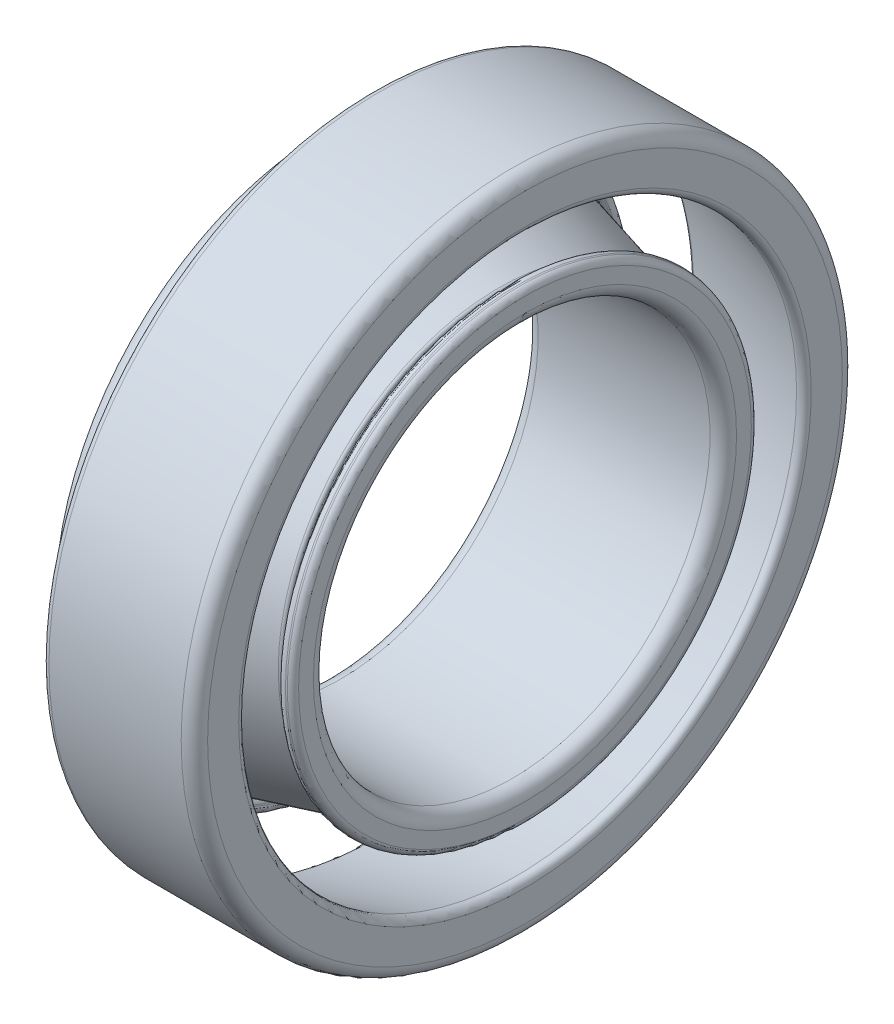
ISO-10303-21;
HEADER;
FILE_DESCRIPTION(('STEP AP214'),'2;1');
FILE_NAME('part.step','',(''),(''),'','','');
FILE_SCHEMA(('AUTOMOTIVE_DESIGN { 1 0 10303 214 1 1 1 1 }'));
ENDSEC;
DATA;
#1=APPLICATION_CONTEXT('core data for automotive mechanical design processes');
#2=APPLICATION_PROTOCOL_DEFINITION('international standard','automotive_design',2000,#1);
#3=PRODUCT_CONTEXT('',#1,'mechanical');
#4=PRODUCT('Part','Part','',(#3));
#5=PRODUCT_RELATED_PRODUCT_CATEGORY('part','',(#4));
#6=PRODUCT_DEFINITION_FORMATION('','',#4);
#7=PRODUCT_DEFINITION_CONTEXT('part definition',#1,'design');
#8=PRODUCT_DEFINITION('design','',#6,#7);
#9=PRODUCT_DEFINITION_SHAPE('','',#8);
#10=(LENGTH_UNIT() NAMED_UNIT(*) SI_UNIT(.MILLI.,.METRE.));
#11=(NAMED_UNIT(*) PLANE_ANGLE_UNIT() SI_UNIT($,.RADIAN.));
#12=(NAMED_UNIT(*) SI_UNIT($,.STERADIAN.) SOLID_ANGLE_UNIT());
#13=UNCERTAINTY_MEASURE_WITH_UNIT(LENGTH_MEASURE(1.E-05),#10,'distance_accuracy_value','');
#14=(GEOMETRIC_REPRESENTATION_CONTEXT(3) GLOBAL_UNCERTAINTY_ASSIGNED_CONTEXT((#13)) GLOBAL_UNIT_ASSIGNED_CONTEXT((#10,
#11,#12)) REPRESENTATION_CONTEXT('',''));
#15=CARTESIAN_POINT('',(0.,0.,0.));
#16=DIRECTION('',(0.,0.,1.));
#17=DIRECTION('',(1.,0.,0.));
#18=AXIS2_PLACEMENT_3D('',#15,#16,#17);
#19=CARTESIAN_POINT('',(-2.00000000000001,0.,0.));
#20=DIRECTION('',(-1.,0.,0.));
#21=DIRECTION('',(0.,0.,1.));
#22=AXIS2_PLACEMENT_3D('',#19,#20,#21);
#23=TOROIDAL_SURFACE('',#22,32.,2.);
#24=CARTESIAN_POINT('',(0.,0.,0.));
#25=DIRECTION('',(-1.,0.,0.));
#26=DIRECTION('',(0.,0.,1.));
#27=AXIS2_PLACEMENT_3D('',#24,#25,#26);
#28=CIRCLE('',#27,32.);
#29=CARTESIAN_POINT('',(0.,0.,32.));
#30=VERTEX_POINT('',#29);
#31=EDGE_CURVE('E105',#30,#30,#28,.T.);
#32=ORIENTED_EDGE('',*,*,#31,.F.);
#33=EDGE_LOOP('',(#32));
#34=FACE_BOUND('',#33,.T.);
#35=CARTESIAN_POINT('',(-2.00000000000002,0.,0.));
#36=DIRECTION('',(-1.,0.,0.));
#37=DIRECTION('',(0.,0.,1.));
#38=AXIS2_PLACEMENT_3D('',#35,#36,#37);
#39=CIRCLE('',#38,30.);
#40=CARTESIAN_POINT('',(-2.00000000000002,0.,30.));
#41=VERTEX_POINT('',#40);
#42=EDGE_CURVE('E11',#41,#41,#39,.T.);
#43=ORIENTED_EDGE('',*,*,#42,.T.);
#44=EDGE_LOOP('',(#43));
#45=FACE_BOUND('',#44,.T.);
#46=ADVANCED_FACE('F41',(#34,#45),#23,.T.);
#47=CARTESIAN_POINT('',(0.,0.,0.));
#48=DIRECTION('',(-1.,0.,0.));
#49=DIRECTION('',(0.,0.,1.));
#50=AXIS2_PLACEMENT_3D('',#47,#48,#49);
#51=CYLINDRICAL_SURFACE('',#50,30.);
#52=ORIENTED_EDGE('',*,*,#42,.F.);
#53=EDGE_LOOP('',(#52));
#54=FACE_BOUND('',#53,.T.);
#55=CARTESIAN_POINT('',(-28.,0.,0.));
#56=DIRECTION('',(-1.,0.,0.));
#57=DIRECTION('',(0.,0.,1.));
#58=AXIS2_PLACEMENT_3D('',#55,#56,#57);
#59=CIRCLE('',#58,30.);
#60=CARTESIAN_POINT('',(-28.,0.,30.));
#61=VERTEX_POINT('',#60);
#62=EDGE_CURVE('E47',#61,#61,#59,.T.);
#63=ORIENTED_EDGE('',*,*,#62,.T.);
#64=EDGE_LOOP('',(#63));
#65=FACE_BOUND('',#64,.T.);
#66=ADVANCED_FACE('F112',(#54,#65),#51,.F.);
#67=CARTESIAN_POINT('',(-28.,0.,0.));
#68=DIRECTION('',(-1.,0.,0.));
#69=DIRECTION('',(0.,0.,1.));
#70=AXIS2_PLACEMENT_3D('',#67,#68,#69);
#71=TOROIDAL_SURFACE('',#70,32.,2.);
#72=ORIENTED_EDGE('',*,*,#62,.F.);
#73=EDGE_LOOP('',(#72));
#74=FACE_BOUND('',#73,.T.);
#75=CARTESIAN_POINT('',(-30.,0.,0.));
#76=DIRECTION('',(-1.,0.,0.));
#77=DIRECTION('',(0.,0.,1.));
#78=AXIS2_PLACEMENT_3D('',#75,#76,#77);
#79=CIRCLE('',#78,32.);
#80=CARTESIAN_POINT('',(-30.,0.,32.));
#81=VERTEX_POINT('',#80);
#82=EDGE_CURVE('E51',#81,#81,#79,.T.);
#83=ORIENTED_EDGE('',*,*,#82,.T.);
#84=EDGE_LOOP('',(#83));
#85=FACE_BOUND('',#84,.T.);
#86=ADVANCED_FACE('F116',(#74,#85),#71,.T.);
#87=CARTESIAN_POINT('',(-30.,32.,0.));
#88=DIRECTION('',(1.,0.,0.));
#89=DIRECTION('',(0.,0.,-1.));
#90=AXIS2_PLACEMENT_3D('',#87,#88,#89);
#91=PLANE('',#90);
#92=ORIENTED_EDGE('',*,*,#82,.F.);
#93=EDGE_LOOP('',(#92));
#94=FACE_BOUND('',#93,.T.);
#95=CARTESIAN_POINT('',(-30.,0.,0.));
#96=DIRECTION('',(-1.,0.,0.));
#97=DIRECTION('',(0.,0.,1.));
#98=AXIS2_PLACEMENT_3D('',#95,#96,#97);
#99=CIRCLE('',#98,40.2432981977286);
#100=CARTESIAN_POINT('',(-30.,0.,40.2432981977286));
#101=VERTEX_POINT('',#100);
#102=EDGE_CURVE('E55',#101,#101,#99,.T.);
#103=ORIENTED_EDGE('',*,*,#102,.T.);
#104=EDGE_LOOP('',(#103));
#105=FACE_BOUND('',#104,.T.);
#106=ADVANCED_FACE('F121',(#94,#105),#91,.F.);
#107=CARTESIAN_POINT('',(-28.,0.,0.));
#108=DIRECTION('',(-1.,0.,0.));
#109=DIRECTION('',(0.,0.,1.));
#110=AXIS2_PLACEMENT_3D('',#107,#108,#109);
#111=TOROIDAL_SURFACE('',#110,40.2432981977286,1.99999999999998);
#112=ORIENTED_EDGE('',*,*,#102,.F.);
#113=EDGE_LOOP('',(#112));
#114=FACE_BOUND('',#113,.T.);
#115=CARTESIAN_POINT('',(-27.4955232455346,0.,0.));
#116=DIRECTION('',(-1.,0.,0.));
#117=DIRECTION('',(0.,0.,1.));
#118=AXIS2_PLACEMENT_3D('',#115,#116,#117);
#119=CIRCLE('',#118,42.1786284548692);
#120=CARTESIAN_POINT('',(-27.4955232455346,0.,42.1786284548692));
#121=VERTEX_POINT('',#120);
#122=EDGE_CURVE('E60',#121,#121,#119,.T.);
#123=ORIENTED_EDGE('',*,*,#122,.T.);
#124=EDGE_LOOP('',(#123));
#125=FACE_BOUND('',#124,.T.);
#126=ADVANCED_FACE('F127',(#114,#125),#111,.T.);
#127=CARTESIAN_POINT('',(-25.9506470557311,0.,0.));
#128=DIRECTION('',(-1.,0.,0.));
#129=DIRECTION('',(0.,0.,1.));
#130=AXIS2_PLACEMENT_3D('',#127,#128,#129);
#131=CONICAL_SURFACE('',#130,41.7759301952789,0.254992733634665);
#132=ORIENTED_EDGE('',*,*,#122,.F.);
#133=EDGE_LOOP('',(#132));
#134=FACE_BOUND('',#133,.T.);
#135=CARTESIAN_POINT('',(-25.9506470557311,0.,0.));
#136=DIRECTION('',(-1.,0.,0.));
#137=DIRECTION('',(0.,0.,1.));
#138=AXIS2_PLACEMENT_3D('',#135,#136,#137);
#139=CIRCLE('',#138,41.7759301952789);
#140=CARTESIAN_POINT('',(-25.9506470557311,0.,41.7759301952789));
#141=VERTEX_POINT('',#140);
#142=EDGE_CURVE('E63',#141,#141,#139,.T.);
#143=ORIENTED_EDGE('',*,*,#142,.T.);
#144=EDGE_LOOP('',(#143));
#145=FACE_BOUND('',#144,.T.);
#146=ADVANCED_FACE('F131',(#134,#145),#131,.T.);
#147=CARTESIAN_POINT('',(-26.2028854329638,0.,0.));
#148=DIRECTION('',(-1.,0.,0.));
#149=DIRECTION('',(0.,0.,1.));
#150=AXIS2_PLACEMENT_3D('',#147,#148,#149);
#151=TOROIDAL_SURFACE('',#150,40.8082650667086,0.999999999999995);
#152=ORIENTED_EDGE('',*,*,#142,.F.);
#153=EDGE_LOOP('',(#152));
#154=FACE_BOUND('',#153,.T.);
#155=CARTESIAN_POINT('',(-25.2352203043935,0.,0.));
#156=DIRECTION('',(-1.,0.,0.));
#157=DIRECTION('',(0.,0.,1.));
#158=AXIS2_PLACEMENT_3D('',#155,#156,#157);
#159=CIRCLE('',#158,40.5560266894759);
#160=CARTESIAN_POINT('',(-25.2352203043935,0.,40.5560266894759));
#161=VERTEX_POINT('',#160);
#162=EDGE_CURVE('E66',#161,#161,#159,.T.);
#163=ORIENTED_EDGE('',*,*,#162,.T.);
#164=EDGE_LOOP('',(#163));
#165=FACE_BOUND('',#164,.T.);
#166=ADVANCED_FACE('F135',(#154,#165),#151,.T.);
#167=CARTESIAN_POINT('',(-25.2820827739324,0.,0.));
#168=DIRECTION('',(1.,0.,0.));
#169=DIRECTION('',(0.,0.,-1.));
#170=AXIS2_PLACEMENT_3D('',#167,#168,#169);
#171=CONICAL_SURFACE('',#170,40.3762476324231,1.31580359316017);
#172=ORIENTED_EDGE('',*,*,#162,.F.);
#173=EDGE_LOOP('',(#172));
#174=FACE_BOUND('',#173,.T.);
#175=CARTESIAN_POINT('',(-25.2820827739324,0.,0.));
#176=DIRECTION('',(-1.,0.,0.));
#177=DIRECTION('',(0.,0.,1.));
#178=AXIS2_PLACEMENT_3D('',#175,#176,#177);
#179=CIRCLE('',#178,40.3762476324231);
#180=CARTESIAN_POINT('',(-25.2820827739324,0.,40.3762476324231));
#181=VERTEX_POINT('',#180);
#182=EDGE_CURVE('E69',#181,#181,#179,.T.);
#183=ORIENTED_EDGE('',*,*,#182,.T.);
#184=EDGE_LOOP('',(#183));
#185=FACE_BOUND('',#184,.T.);
#186=ADVANCED_FACE('F139',(#174,#185),#171,.F.);
#187=CARTESIAN_POINT('',(-25.7659153382175,0.,0.));
#188=DIRECTION('',(-1.,0.,0.));
#189=DIRECTION('',(0.,0.,1.));
#190=AXIS2_PLACEMENT_3D('',#187,#188,#189);
#191=TOROIDAL_SURFACE('',#190,40.5023668210394,0.500000000000021);
#192=ORIENTED_EDGE('',*,*,#182,.F.);
#193=EDGE_LOOP('',(#192));
#194=FACE_BOUND('',#193,.T.);
#195=CARTESIAN_POINT('',(-25.7235441281336,0.,0.));
#196=DIRECTION('',(-1.,0.,0.));
#197=DIRECTION('',(0.,0.,1.));
#198=AXIS2_PLACEMENT_3D('',#195,#196,#197);
#199=CIRCLE('',#198,40.0041653752807);
#200=CARTESIAN_POINT('',(-25.7235441281336,0.,40.0041653752807));
#201=VERTEX_POINT('',#200);
#202=EDGE_CURVE('E72',#201,#201,#199,.T.);
#203=ORIENTED_EDGE('',*,*,#202,.T.);
#204=EDGE_LOOP('',(#203));
#205=FACE_BOUND('',#204,.T.);
#206=ADVANCED_FACE('F143',(#194,#205),#191,.T.);
#207=CARTESIAN_POINT('',(-25.6388017079659,0.,0.));
#208=DIRECTION('',(-1.,0.,0.));
#209=DIRECTION('',(0.,0.,1.));
#210=AXIS2_PLACEMENT_3D('',#207,#208,#209);
#211=TOROIDAL_SURFACE('',#210,39.0077624837634,1.);
#212=ORIENTED_EDGE('',*,*,#202,.F.);
#213=EDGE_LOOP('',(#212));
#214=FACE_BOUND('',#213,.T.);
#215=CARTESIAN_POINT('',(-24.8105577346037,0.,0.));
#216=DIRECTION('',(-1.,0.,0.));
#217=DIRECTION('',(0.,0.,1.));
#218=AXIS2_PLACEMENT_3D('',#215,#216,#217);
#219=CIRCLE('',#218,38.4473948182176);
#220=CARTESIAN_POINT('',(-24.8105577346037,0.,38.4473948182176));
#221=VERTEX_POINT('',#220);
#222=EDGE_CURVE('E75',#221,#221,#219,.T.);
#223=ORIENTED_EDGE('',*,*,#222,.T.);
#224=EDGE_LOOP('',(#223));
#225=FACE_BOUND('',#224,.T.);
#226=ADVANCED_FACE('F147',(#214,#225),#211,.F.);
#227=CARTESIAN_POINT('',(-24.3964357479226,0.,0.));
#228=DIRECTION('',(-1.,0.,0.));
#229=DIRECTION('',(0.,0.,1.));
#230=AXIS2_PLACEMENT_3D('',#227,#228,#229);
#231=TOROIDAL_SURFACE('',#230,38.1672109854448,0.499999999999998);
#232=ORIENTED_EDGE('',*,*,#222,.F.);
#233=EDGE_LOOP('',(#232));
#234=FACE_BOUND('',#233,.T.);
#235=CARTESIAN_POINT('',(-24.2703165593062,0.,0.));
#236=DIRECTION('',(-1.,0.,0.));
#237=DIRECTION('',(0.,0.,1.));
#238=AXIS2_PLACEMENT_3D('',#235,#236,#237);
#239=CIRCLE('',#238,38.6510435497299);
#240=CARTESIAN_POINT('',(-24.2703165593062,0.,38.6510435497299));
#241=VERTEX_POINT('',#240);
#242=EDGE_CURVE('E78',#241,#241,#239,.T.);
#243=ORIENTED_EDGE('',*,*,#242,.T.);
#244=EDGE_LOOP('',(#243));
#245=FACE_BOUND('',#244,.T.);
#246=ADVANCED_FACE('F151',(#234,#245),#231,.T.);
#247=CARTESIAN_POINT('',(-3.95963518660535,0.,0.));
#248=DIRECTION('',(-1.,0.,0.));
#249=DIRECTION('',(0.,0.,1.));
#250=AXIS2_PLACEMENT_3D('',#247,#248,#249);
#251=CONICAL_SURFACE('',#250,33.3567189340335,0.254992733634694);
#252=ORIENTED_EDGE('',*,*,#242,.F.);
#253=EDGE_LOOP('',(#252));
#254=FACE_BOUND('',#253,.T.);
#255=CARTESIAN_POINT('',(-3.95963518660535,0.,0.));
#256=DIRECTION('',(-1.,0.,0.));
#257=DIRECTION('',(0.,0.,1.));
#258=AXIS2_PLACEMENT_3D('',#255,#256,#257);
#259=CIRCLE('',#258,33.3567189340335);
#260=CARTESIAN_POINT('',(-3.95963518660535,0.,33.3567189340335));
#261=VERTEX_POINT('',#260);
#262=EDGE_CURVE('E81',#261,#261,#259,.T.);
#263=ORIENTED_EDGE('',*,*,#262,.T.);
#264=EDGE_LOOP('',(#263));
#265=FACE_BOUND('',#264,.T.);
#266=ADVANCED_FACE('F155',(#254,#265),#251,.T.);
#267=CARTESIAN_POINT('',(-4.08575437522171,0.,0.));
#268=DIRECTION('',(-1.,0.,0.));
#269=DIRECTION('',(0.,0.,1.));
#270=AXIS2_PLACEMENT_3D('',#267,#268,#269);
#271=TOROIDAL_SURFACE('',#270,32.8728863697483,0.5);
#272=ORIENTED_EDGE('',*,*,#262,.F.);
#273=EDGE_LOOP('',(#272));
#274=FACE_BOUND('',#273,.T.);
#275=CARTESIAN_POINT('',(-3.58755292946304,0.,0.));
#276=DIRECTION('',(-1.,0.,0.));
#277=DIRECTION('',(0.,0.,1.));
#278=AXIS2_PLACEMENT_3D('',#275,#276,#277);
#279=CIRCLE('',#278,32.9152575798322);
#280=CARTESIAN_POINT('',(-3.58755292946304,0.,32.9152575798322));
#281=VERTEX_POINT('',#280);
#282=EDGE_CURVE('E84',#281,#281,#279,.T.);
#283=ORIENTED_EDGE('',*,*,#282,.T.);
#284=EDGE_LOOP('',(#283));
#285=FACE_BOUND('',#284,.T.);
#286=ADVANCED_FACE('F159',(#274,#285),#271,.T.);
#287=CARTESIAN_POINT('',(-2.5911500379457,0.,0.));
#288=DIRECTION('',(-1.,0.,0.));
#289=DIRECTION('',(0.,0.,1.));
#290=AXIS2_PLACEMENT_3D('',#287,#288,#289);
#291=TOROIDAL_SURFACE('',#290,33.,1.);
#292=ORIENTED_EDGE('',*,*,#282,.F.);
#293=EDGE_LOOP('',(#292));
#294=FACE_BOUND('',#293,.T.);
#295=CARTESIAN_POINT('',(-2.03078237239993,0.,0.));
#296=DIRECTION('',(-1.,0.,0.));
#297=DIRECTION('',(0.,0.,1.));
#298=AXIS2_PLACEMENT_3D('',#295,#296,#297);
#299=CIRCLE('',#298,33.8282439733622);
#300=CARTESIAN_POINT('',(-2.03078237239993,0.,33.8282439733622));
#301=VERTEX_POINT('',#300);
#302=EDGE_CURVE('E87',#301,#301,#299,.T.);
#303=ORIENTED_EDGE('',*,*,#302,.T.);
#304=EDGE_LOOP('',(#303));
#305=FACE_BOUND('',#304,.T.);
#306=ADVANCED_FACE('F163',(#294,#305),#291,.F.);
#307=CARTESIAN_POINT('',(-1.75059853962705,0.,0.));
#308=DIRECTION('',(-1.,0.,0.));
#309=DIRECTION('',(0.,0.,1.));
#310=AXIS2_PLACEMENT_3D('',#307,#308,#309);
#311=TOROIDAL_SURFACE('',#310,34.2423659600433,0.500000000000001);
#312=ORIENTED_EDGE('',*,*,#302,.F.);
#313=EDGE_LOOP('',(#312));
#314=FACE_BOUND('',#313,.T.);
#315=CARTESIAN_POINT('',(-2.23443110391221,0.,0.));
#316=DIRECTION('',(-1.,0.,0.));
#317=DIRECTION('',(0.,0.,1.));
#318=AXIS2_PLACEMENT_3D('',#315,#316,#317);
#319=CIRCLE('',#318,34.3684851486596);
#320=CARTESIAN_POINT('',(-2.23443110391221,0.,34.3684851486596));
#321=VERTEX_POINT('',#320);
#322=EDGE_CURVE('E90',#321,#321,#319,.T.);
#323=ORIENTED_EDGE('',*,*,#322,.T.);
#324=EDGE_LOOP('',(#323));
#325=FACE_BOUND('',#324,.T.);
#326=ADVANCED_FACE('F167',(#314,#325),#311,.T.);
#327=CARTESIAN_POINT('',(-2.18756863437334,0.,0.));
#328=DIRECTION('',(1.,0.,0.));
#329=DIRECTION('',(0.,0.,-1.));
#330=AXIS2_PLACEMENT_3D('',#327,#328,#329);
#331=CONICAL_SURFACE('',#330,34.5482642057125,1.3158035931601);
#332=ORIENTED_EDGE('',*,*,#322,.F.);
#333=EDGE_LOOP('',(#332));
#334=FACE_BOUND('',#333,.T.);
#335=CARTESIAN_POINT('',(-2.18756863437334,0.,0.));
#336=DIRECTION('',(-1.,0.,0.));
#337=DIRECTION('',(0.,0.,1.));
#338=AXIS2_PLACEMENT_3D('',#335,#336,#337);
#339=CIRCLE('',#338,34.5482642057125);
#340=CARTESIAN_POINT('',(-2.18756863437334,0.,34.5482642057125));
#341=VERTEX_POINT('',#340);
#342=EDGE_CURVE('E93',#341,#341,#339,.T.);
#343=ORIENTED_EDGE('',*,*,#342,.T.);
#344=EDGE_LOOP('',(#343));
#345=FACE_BOUND('',#344,.T.);
#346=ADVANCED_FACE('F171',(#334,#345),#331,.T.);
#347=CARTESIAN_POINT('',(-1.21990350580303,0.,0.));
#348=DIRECTION('',(-1.,0.,0.));
#349=DIRECTION('',(0.,0.,1.));
#350=AXIS2_PLACEMENT_3D('',#347,#348,#349);
#351=TOROIDAL_SURFACE('',#350,34.2960258284798,0.99999999999998);
#352=ORIENTED_EDGE('',*,*,#342,.F.);
#353=EDGE_LOOP('',(#352));
#354=FACE_BOUND('',#353,.T.);
#355=CARTESIAN_POINT('',(-0.967665128570324,0.,0.));
#356=DIRECTION('',(-1.,0.,0.));
#357=DIRECTION('',(0.,0.,1.));
#358=AXIS2_PLACEMENT_3D('',#355,#356,#357);
#359=CIRCLE('',#358,35.2636909570501);
#360=CARTESIAN_POINT('',(-0.967665128570324,0.,35.2636909570501));
#361=VERTEX_POINT('',#360);
#362=EDGE_CURVE('E96',#361,#361,#359,.T.);
#363=ORIENTED_EDGE('',*,*,#362,.T.);
#364=EDGE_LOOP('',(#363));
#365=FACE_BOUND('',#364,.T.);
#366=ADVANCED_FACE('F175',(#354,#365),#351,.T.);
#367=CARTESIAN_POINT('',(-0.747761622767286,0.,0.));
#368=DIRECTION('',(-1.,0.,0.));
#369=DIRECTION('',(0.,0.,1.));
#370=AXIS2_PLACEMENT_3D('',#367,#368,#369);
#371=CONICAL_SURFACE('',#370,35.206369367366,0.254992733634642);
#372=ORIENTED_EDGE('',*,*,#362,.F.);
#373=EDGE_LOOP('',(#372));
#374=FACE_BOUND('',#373,.T.);
#375=CARTESIAN_POINT('',(-0.747761622767286,0.,0.));
#376=DIRECTION('',(-1.,0.,0.));
#377=DIRECTION('',(0.,0.,1.));
#378=AXIS2_PLACEMENT_3D('',#375,#376,#377);
#379=CIRCLE('',#378,35.206369367366);
#380=CARTESIAN_POINT('',(-0.747761622767286,0.,35.206369367366));
#381=VERTEX_POINT('',#380);
#382=EDGE_CURVE('E99',#381,#381,#379,.T.);
#383=ORIENTED_EDGE('',*,*,#382,.T.);
#384=EDGE_LOOP('',(#383));
#385=FACE_BOUND('',#384,.T.);
#386=ADVANCED_FACE('F179',(#374,#385),#371,.T.);
#387=CARTESIAN_POINT('',(-1.,0.,0.));
#388=DIRECTION('',(-1.,0.,0.));
#389=DIRECTION('',(0.,0.,1.));
#390=AXIS2_PLACEMENT_3D('',#387,#388,#389);
#391=TOROIDAL_SURFACE('',#390,34.2387042387957,0.999999999999978);
#392=ORIENTED_EDGE('',*,*,#382,.F.);
#393=EDGE_LOOP('',(#392));
#394=FACE_BOUND('',#393,.T.);
#395=CARTESIAN_POINT('',(0.,0.,0.));
#396=DIRECTION('',(-1.,0.,0.));
#397=DIRECTION('',(0.,0.,1.));
#398=AXIS2_PLACEMENT_3D('',#395,#396,#397);
#399=CIRCLE('',#398,34.2387042387956);
#400=CARTESIAN_POINT('',(0.,0.,34.2387042387956));
#401=VERTEX_POINT('',#400);
#402=EDGE_CURVE('E102',#401,#401,#399,.T.);
#403=ORIENTED_EDGE('',*,*,#402,.T.);
#404=EDGE_LOOP('',(#403));
#405=FACE_BOUND('',#404,.T.);
#406=ADVANCED_FACE('F183',(#394,#405),#391,.T.);
#407=CARTESIAN_POINT('',(0.,34.2387042387956,0.));
#408=DIRECTION('',(-1.,0.,0.));
#409=DIRECTION('',(0.,0.,1.));
#410=AXIS2_PLACEMENT_3D('',#407,#408,#409);
#411=PLANE('',#410);
#412=ORIENTED_EDGE('',*,*,#402,.F.);
#413=EDGE_LOOP('',(#412));
#414=FACE_BOUND('',#413,.T.);
#415=ORIENTED_EDGE('',*,*,#31,.T.);
#416=EDGE_LOOP('',(#415));
#417=FACE_BOUND('',#416,.T.);
#418=ADVANCED_FACE('F109',(#414,#417),#411,.F.);
#419=CLOSED_SHELL('',(#46,#66,#86,#106,#126,#146,#166,#186,#206,#226,#246,#266,#286,#306,#326,
#346,#366,#386,#406,#418));
#420=MANIFOLD_SOLID_BREP('B2',#419);
#421=CARTESIAN_POINT('',(-22.,0.,0.));
#422=DIRECTION('',(-1.,0.,0.));
#423=DIRECTION('',(0.,0.,1.));
#424=AXIS2_PLACEMENT_3D('',#421,#422,#423);
#425=TOROIDAL_SURFACE('',#424,48.7727483410217,1.);
#426=CARTESIAN_POINT('',(-22.2522383772327,0.,0.));
#427=DIRECTION('',(-1.,0.,0.));
#428=DIRECTION('',(0.,0.,1.));
#429=AXIS2_PLACEMENT_3D('',#426,#427,#428);
#430=CIRCLE('',#429,47.8050832124514);
#431=CARTESIAN_POINT('',(-22.2522383772327,0.,47.8050832124514));
#432=VERTEX_POINT('',#431);
#433=EDGE_CURVE('E40',#432,#432,#430,.T.);
#434=ORIENTED_EDGE('',*,*,#433,.F.);
#435=EDGE_LOOP('',(#434));
#436=FACE_BOUND('',#435,.T.);
#437=CARTESIAN_POINT('',(-23.,0.,0.));
#438=DIRECTION('',(-1.,0.,0.));
#439=DIRECTION('',(0.,0.,1.));
#440=AXIS2_PLACEMENT_3D('',#437,#438,#439);
#441=CIRCLE('',#440,48.7727483410217);
#442=CARTESIAN_POINT('',(-23.,0.,48.7727483410217));
#443=VERTEX_POINT('',#442);
#444=EDGE_CURVE('E371',#443,#443,#441,.T.);
#445=ORIENTED_EDGE('',*,*,#444,.T.);
#446=EDGE_LOOP('',(#445));
#447=FACE_BOUND('',#446,.T.);
#448=ADVANCED_FACE('F343',(#436,#447),#425,.T.);
#449=CARTESIAN_POINT('',(-22.2522383772327,0.,0.));
#450=DIRECTION('',(-1.,0.,0.));
#451=DIRECTION('',(0.,0.,1.));
#452=AXIS2_PLACEMENT_3D('',#449,#450,#451);
#453=CONICAL_SURFACE('',#452,47.8050832124514,0.254992733634693);
#454=CARTESIAN_POINT('',(-1.25223837723272,0.,0.));
#455=DIRECTION('',(-1.,0.,0.));
#456=DIRECTION('',(0.,0.,1.));
#457=AXIS2_PLACEMENT_3D('',#454,#455,#456);
#458=CIRCLE('',#457,42.3310759701803);
#459=CARTESIAN_POINT('',(-1.25223837723272,0.,42.3310759701803));
#460=VERTEX_POINT('',#459);
#461=EDGE_CURVE('E349',#460,#460,#458,.T.);
#462=ORIENTED_EDGE('',*,*,#461,.F.);
#463=EDGE_LOOP('',(#462));
#464=FACE_BOUND('',#463,.T.);
#465=ORIENTED_EDGE('',*,*,#433,.T.);
#466=EDGE_LOOP('',(#465));
#467=FACE_BOUND('',#466,.T.);
#468=ADVANCED_FACE('F408',(#464,#467),#453,.F.);
#469=CARTESIAN_POINT('',(-1.,0.,0.));
#470=DIRECTION('',(-1.,0.,0.));
#471=DIRECTION('',(0.,0.,1.));
#472=AXIS2_PLACEMENT_3D('',#469,#470,#471);
#473=TOROIDAL_SURFACE('',#472,43.2987410987506,0.999999999999999);
#474=CARTESIAN_POINT('',(0.,0.,0.));
#475=DIRECTION('',(-1.,0.,0.));
#476=DIRECTION('',(0.,0.,1.));
#477=AXIS2_PLACEMENT_3D('',#474,#475,#476);
#478=CIRCLE('',#477,43.2987410987506);
#479=CARTESIAN_POINT('',(0.,0.,43.2987410987506));
#480=VERTEX_POINT('',#479);
#481=EDGE_CURVE('E353',#480,#480,#478,.T.);
#482=ORIENTED_EDGE('',*,*,#481,.F.);
#483=EDGE_LOOP('',(#482));
#484=FACE_BOUND('',#483,.T.);
#485=ORIENTED_EDGE('',*,*,#461,.T.);
#486=EDGE_LOOP('',(#485));
#487=FACE_BOUND('',#486,.T.);
#488=ADVANCED_FACE('F403',(#484,#487),#473,.T.);
#489=CARTESIAN_POINT('',(0.,48.,0.));
#490=DIRECTION('',(-1.,0.,0.));
#491=DIRECTION('',(0.,0.,1.));
#492=AXIS2_PLACEMENT_3D('',#489,#490,#491);
#493=PLANE('',#492);
#494=CARTESIAN_POINT('',(0.,0.,0.));
#495=DIRECTION('',(-1.,0.,0.));
#496=DIRECTION('',(0.,0.,1.));
#497=AXIS2_PLACEMENT_3D('',#494,#495,#496);
#498=CIRCLE('',#497,48.);
#499=CARTESIAN_POINT('',(0.,0.,48.));
#500=VERTEX_POINT('',#499);
#501=EDGE_CURVE('E357',#500,#500,#498,.T.);
#502=ORIENTED_EDGE('',*,*,#501,.F.);
#503=EDGE_LOOP('',(#502));
#504=FACE_BOUND('',#503,.T.);
#505=ORIENTED_EDGE('',*,*,#481,.T.);
#506=EDGE_LOOP('',(#505));
#507=FACE_BOUND('',#506,.T.);
#508=ADVANCED_FACE('F397',(#504,#507),#493,.F.);
#509=CARTESIAN_POINT('',(-2.,0.,0.));
#510=DIRECTION('',(-1.,0.,0.));
#511=DIRECTION('',(0.,0.,1.));
#512=AXIS2_PLACEMENT_3D('',#509,#510,#511);
#513=TOROIDAL_SURFACE('',#512,48.,2.);
#514=CARTESIAN_POINT('',(-2.,0.,0.));
#515=DIRECTION('',(-1.,0.,0.));
#516=DIRECTION('',(0.,0.,1.));
#517=AXIS2_PLACEMENT_3D('',#514,#515,#516);
#518=CIRCLE('',#517,50.);
#519=CARTESIAN_POINT('',(-2.,0.,50.));
#520=VERTEX_POINT('',#519);
#521=EDGE_CURVE('E362',#520,#520,#518,.T.);
#522=ORIENTED_EDGE('',*,*,#521,.F.);
#523=EDGE_LOOP('',(#522));
#524=FACE_BOUND('',#523,.T.);
#525=ORIENTED_EDGE('',*,*,#501,.T.);
#526=EDGE_LOOP('',(#525));
#527=FACE_BOUND('',#526,.T.);
#528=ADVANCED_FACE('F391',(#524,#527),#513,.T.);
#529=CARTESIAN_POINT('',(0.,0.,0.));
#530=DIRECTION('',(-1.,0.,0.));
#531=DIRECTION('',(0.,0.,1.));
#532=AXIS2_PLACEMENT_3D('',#529,#530,#531);
#533=CYLINDRICAL_SURFACE('',#532,50.);
#534=CARTESIAN_POINT('',(-22.,0.,0.));
#535=DIRECTION('',(-1.,0.,0.));
#536=DIRECTION('',(0.,0.,1.));
#537=AXIS2_PLACEMENT_3D('',#534,#535,#536);
#538=CIRCLE('',#537,50.);
#539=CARTESIAN_POINT('',(-22.,0.,50.));
#540=VERTEX_POINT('',#539);
#541=EDGE_CURVE('E365',#540,#540,#538,.T.);
#542=ORIENTED_EDGE('',*,*,#541,.F.);
#543=EDGE_LOOP('',(#542));
#544=FACE_BOUND('',#543,.T.);
#545=ORIENTED_EDGE('',*,*,#521,.T.);
#546=EDGE_LOOP('',(#545));
#547=FACE_BOUND('',#546,.T.);
#548=ADVANCED_FACE('F385',(#544,#547),#533,.T.);
#549=CARTESIAN_POINT('',(-22.,0.,0.));
#550=DIRECTION('',(-1.,0.,0.));
#551=DIRECTION('',(0.,0.,1.));
#552=AXIS2_PLACEMENT_3D('',#549,#550,#551);
#553=TOROIDAL_SURFACE('',#552,49.,1.);
#554=CARTESIAN_POINT('',(-23.,0.,0.));
#555=DIRECTION('',(-1.,0.,0.));
#556=DIRECTION('',(0.,0.,1.));
#557=AXIS2_PLACEMENT_3D('',#554,#555,#556);
#558=CIRCLE('',#557,49.);
#559=CARTESIAN_POINT('',(-23.,0.,49.));
#560=VERTEX_POINT('',#559);
#561=EDGE_CURVE('E368',#560,#560,#558,.T.);
#562=ORIENTED_EDGE('',*,*,#561,.F.);
#563=EDGE_LOOP('',(#562));
#564=FACE_BOUND('',#563,.T.);
#565=ORIENTED_EDGE('',*,*,#541,.T.);
#566=EDGE_LOOP('',(#565));
#567=FACE_BOUND('',#566,.T.);
#568=ADVANCED_FACE('F379',(#564,#567),#553,.T.);
#569=CARTESIAN_POINT('',(-23.,49.,0.));
#570=DIRECTION('',(1.,0.,0.));
#571=DIRECTION('',(0.,0.,-1.));
#572=AXIS2_PLACEMENT_3D('',#569,#570,#571);
#573=PLANE('',#572);
#574=ORIENTED_EDGE('',*,*,#444,.F.);
#575=EDGE_LOOP('',(#574));
#576=FACE_BOUND('',#575,.T.);
#577=ORIENTED_EDGE('',*,*,#561,.T.);
#578=EDGE_LOOP('',(#577));
#579=FACE_BOUND('',#578,.T.);
#580=ADVANCED_FACE('F376',(#576,#579),#573,.F.);
#581=CLOSED_SHELL('',(#448,#468,#488,#508,#528,#548,#568,#580));
#582=MANIFOLD_SOLID_BREP('B6',#581);
#583=ADVANCED_BREP_SHAPE_REPRESENTATION('',(#18,#420,#582),#14);
#584=SHAPE_DEFINITION_REPRESENTATION(#9,#583);
ENDSEC;
END-ISO-10303-21;
